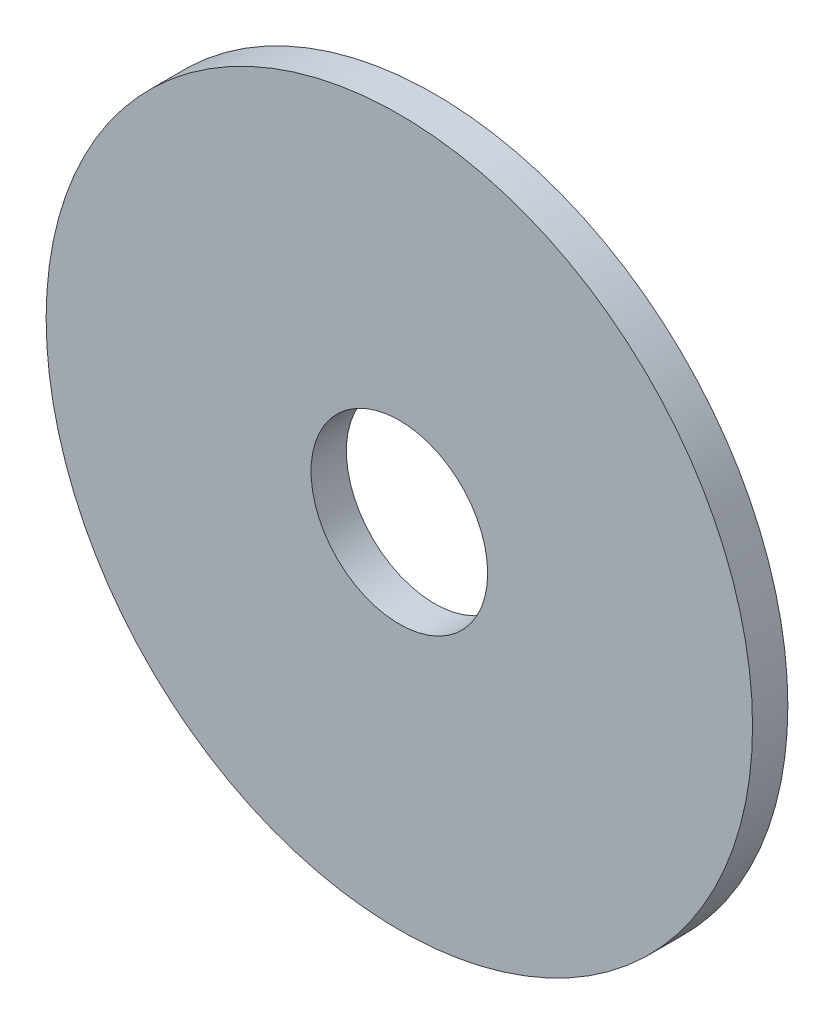
ISO-10303-21;
HEADER;
FILE_DESCRIPTION(('STEP AP214'),'2;1');
FILE_NAME('part.step','',(''),(''),'','','');
FILE_SCHEMA(('AUTOMOTIVE_DESIGN { 1 0 10303 214 1 1 1 1 }'));
ENDSEC;
DATA;
#1=APPLICATION_CONTEXT('core data for automotive mechanical design processes');
#2=APPLICATION_PROTOCOL_DEFINITION('international standard','automotive_design',2000,#1);
#3=PRODUCT_CONTEXT('',#1,'mechanical');
#4=PRODUCT('Part','Part','',(#3));
#5=PRODUCT_RELATED_PRODUCT_CATEGORY('part','',(#4));
#6=PRODUCT_DEFINITION_FORMATION('','',#4);
#7=PRODUCT_DEFINITION_CONTEXT('part definition',#1,'design');
#8=PRODUCT_DEFINITION('design','',#6,#7);
#9=PRODUCT_DEFINITION_SHAPE('','',#8);
#10=(LENGTH_UNIT() NAMED_UNIT(*) SI_UNIT(.MILLI.,.METRE.));
#11=(NAMED_UNIT(*) PLANE_ANGLE_UNIT() SI_UNIT($,.RADIAN.));
#12=(NAMED_UNIT(*) SI_UNIT($,.STERADIAN.) SOLID_ANGLE_UNIT());
#13=UNCERTAINTY_MEASURE_WITH_UNIT(LENGTH_MEASURE(1.E-05),#10,'distance_accuracy_value','');
#14=(GEOMETRIC_REPRESENTATION_CONTEXT(3) GLOBAL_UNCERTAINTY_ASSIGNED_CONTEXT((#13)) GLOBAL_UNIT_ASSIGNED_CONTEXT((#10,
#11,#12)) REPRESENTATION_CONTEXT('',''));
#15=CARTESIAN_POINT('',(0.,0.,0.));
#16=DIRECTION('',(0.,0.,1.));
#17=DIRECTION('',(1.,0.,0.));
#18=AXIS2_PLACEMENT_3D('',#15,#16,#17);
#19=CARTESIAN_POINT('',(0.,0.,1.));
#20=DIRECTION('',(0.,0.,1.));
#21=DIRECTION('',(1.,0.,0.));
#22=AXIS2_PLACEMENT_3D('',#19,#20,#21);
#23=PLANE('',#22);
#24=CARTESIAN_POINT('',(0.,0.,1.));
#25=DIRECTION('',(0.,0.,1.));
#26=DIRECTION('',(1.,0.,0.));
#27=AXIS2_PLACEMENT_3D('',#24,#25,#26);
#28=CIRCLE('',#27,10.);
#29=CARTESIAN_POINT('',(10.,0.,1.));
#30=VERTEX_POINT('',#29);
#31=EDGE_CURVE('E10',#30,#30,#28,.T.);
#32=ORIENTED_EDGE('',*,*,#31,.T.);
#33=EDGE_LOOP('',(#32));
#34=FACE_BOUND('',#33,.T.);
#35=CARTESIAN_POINT('',(0.,0.,1.));
#36=DIRECTION('',(0.,0.,1.));
#37=DIRECTION('',(1.,0.,0.));
#38=AXIS2_PLACEMENT_3D('',#35,#36,#37);
#39=CIRCLE('',#38,2.5);
#40=CARTESIAN_POINT('',(2.5,0.,1.));
#41=VERTEX_POINT('',#40);
#42=EDGE_CURVE('E54',#41,#41,#39,.T.);
#43=ORIENTED_EDGE('',*,*,#42,.F.);
#44=EDGE_LOOP('',(#43));
#45=FACE_BOUND('',#44,.T.);
#46=ADVANCED_FACE('F41',(#34,#45),#23,.T.);
#47=CARTESIAN_POINT('',(0.,0.,0.));
#48=DIRECTION('',(0.,0.,1.));
#49=DIRECTION('',(1.,0.,0.));
#50=AXIS2_PLACEMENT_3D('',#47,#48,#49);
#51=PLANE('',#50);
#52=CARTESIAN_POINT('',(0.,0.,0.));
#53=DIRECTION('',(0.,0.,1.));
#54=DIRECTION('',(1.,0.,0.));
#55=AXIS2_PLACEMENT_3D('',#52,#53,#54);
#56=CIRCLE('',#55,10.);
#57=CARTESIAN_POINT('',(10.,0.,0.));
#58=VERTEX_POINT('',#57);
#59=EDGE_CURVE('E45',#58,#58,#56,.T.);
#60=ORIENTED_EDGE('',*,*,#59,.F.);
#61=EDGE_LOOP('',(#60));
#62=FACE_BOUND('',#61,.T.);
#63=CARTESIAN_POINT('',(0.,0.,0.));
#64=DIRECTION('',(0.,0.,1.));
#65=DIRECTION('',(1.,0.,0.));
#66=AXIS2_PLACEMENT_3D('',#63,#64,#65);
#67=CIRCLE('',#66,2.5);
#68=CARTESIAN_POINT('',(2.5,0.,0.));
#69=VERTEX_POINT('',#68);
#70=EDGE_CURVE('E56',#69,#69,#67,.T.);
#71=ORIENTED_EDGE('',*,*,#70,.T.);
#72=EDGE_LOOP('',(#71));
#73=FACE_BOUND('',#72,.T.);
#74=ADVANCED_FACE('F68',(#62,#73),#51,.F.);
#75=CARTESIAN_POINT('',(0.,0.,1.));
#76=DIRECTION('',(0.,0.,-1.));
#77=DIRECTION('',(-1.,0.,0.));
#78=AXIS2_PLACEMENT_3D('',#75,#76,#77);
#79=CYLINDRICAL_SURFACE('',#78,10.);
#80=ORIENTED_EDGE('',*,*,#31,.F.);
#81=EDGE_LOOP('',(#80));
#82=FACE_BOUND('',#81,.T.);
#83=ORIENTED_EDGE('',*,*,#59,.T.);
#84=EDGE_LOOP('',(#83));
#85=FACE_BOUND('',#84,.T.);
#86=ADVANCED_FACE('F43',(#82,#85),#79,.T.);
#87=CARTESIAN_POINT('',(0.,0.,1.));
#88=DIRECTION('',(0.,0.,-1.));
#89=DIRECTION('',(-1.,0.,0.));
#90=AXIS2_PLACEMENT_3D('',#87,#88,#89);
#91=CYLINDRICAL_SURFACE('',#90,2.5);
#92=ORIENTED_EDGE('',*,*,#42,.T.);
#93=EDGE_LOOP('',(#92));
#94=FACE_BOUND('',#93,.T.);
#95=ORIENTED_EDGE('',*,*,#70,.F.);
#96=EDGE_LOOP('',(#95));
#97=FACE_BOUND('',#96,.T.);
#98=ADVANCED_FACE('F64',(#94,#97),#91,.F.);
#99=CLOSED_SHELL('',(#46,#74,#86,#98));
#100=MANIFOLD_SOLID_BREP('B2',#99);
#101=ADVANCED_BREP_SHAPE_REPRESENTATION('',(#18,#100),#14);
#102=SHAPE_DEFINITION_REPRESENTATION(#9,#101);
ENDSEC;
END-ISO-10303-21;
